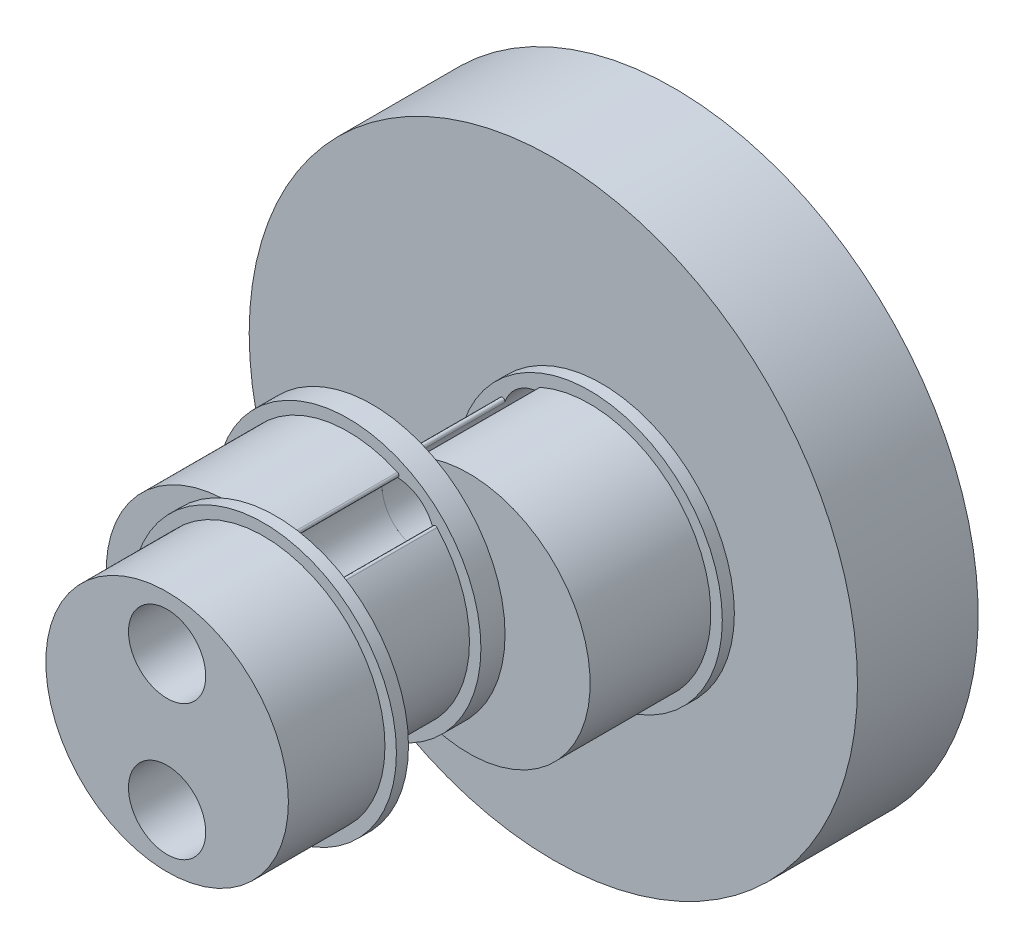
ISO-10303-21;
HEADER;
FILE_DESCRIPTION(('STEP AP214'),'2;1');
FILE_NAME('part.step','',(''),(''),'','','');
FILE_SCHEMA(('AUTOMOTIVE_DESIGN { 1 0 10303 214 1 1 1 1 }'));
ENDSEC;
DATA;
#1=APPLICATION_CONTEXT('core data for automotive mechanical design processes');
#2=APPLICATION_PROTOCOL_DEFINITION('international standard','automotive_design',2000,#1);
#3=PRODUCT_CONTEXT('',#1,'mechanical');
#4=PRODUCT('Part','Part','',(#3));
#5=PRODUCT_RELATED_PRODUCT_CATEGORY('part','',(#4));
#6=PRODUCT_DEFINITION_FORMATION('','',#4);
#7=PRODUCT_DEFINITION_CONTEXT('part definition',#1,'design');
#8=PRODUCT_DEFINITION('design','',#6,#7);
#9=PRODUCT_DEFINITION_SHAPE('','',#8);
#10=(LENGTH_UNIT() NAMED_UNIT(*) SI_UNIT(.MILLI.,.METRE.));
#11=(NAMED_UNIT(*) PLANE_ANGLE_UNIT() SI_UNIT($,.RADIAN.));
#12=(NAMED_UNIT(*) SI_UNIT($,.STERADIAN.) SOLID_ANGLE_UNIT());
#13=UNCERTAINTY_MEASURE_WITH_UNIT(LENGTH_MEASURE(1.E-05),#10,'distance_accuracy_value','');
#14=(GEOMETRIC_REPRESENTATION_CONTEXT(3) GLOBAL_UNCERTAINTY_ASSIGNED_CONTEXT((#13)) GLOBAL_UNIT_ASSIGNED_CONTEXT((#10,
#11,#12)) REPRESENTATION_CONTEXT('',''));
#15=CARTESIAN_POINT('',(0.,0.,0.));
#16=DIRECTION('',(0.,0.,1.));
#17=DIRECTION('',(1.,0.,0.));
#18=AXIS2_PLACEMENT_3D('',#15,#16,#17);
#19=CARTESIAN_POINT('',(0.,0.,8.5));
#20=DIRECTION('',(0.,0.,1.));
#21=DIRECTION('',(1.,0.,0.));
#22=AXIS2_PLACEMENT_3D('',#19,#20,#21);
#23=PLANE('',#22);
#24=CARTESIAN_POINT('',(2.,0.,8.5));
#25=DIRECTION('',(0.,0.,1.));
#26=DIRECTION('',(1.,0.,0.));
#27=AXIS2_PLACEMENT_3D('',#24,#25,#26);
#28=CIRCLE('',#27,5.025);
#29=CARTESIAN_POINT('',(-1.68090301305658,3.4207569350176,8.5));
#30=VERTEX_POINT('',#29);
#31=CARTESIAN_POINT('',(-1.68090301305658,-3.4207569350176,8.5));
#32=VERTEX_POINT('',#31);
#33=EDGE_CURVE('E126',#30,#32,#28,.T.);
#34=ORIENTED_EDGE('',*,*,#33,.T.);
#35=CARTESIAN_POINT('',(-1.60765121180172,-3.35268217014163,8.5));
#36=DIRECTION('',(0.,0.,1.));
#37=DIRECTION('',(1.,0.,0.));
#38=AXIS2_PLACEMENT_3D('',#35,#36,#37);
#39=CIRCLE('',#38,0.1);
#40=CARTESIAN_POINT('',(-1.51308349346044,-3.32017145425094,8.5));
#41=VERTEX_POINT('',#40);
#42=EDGE_CURVE('E159',#32,#41,#39,.T.);
#43=ORIENTED_EDGE('',*,*,#42,.T.);
#44=CARTESIAN_POINT('',(0.,-2.8,8.5));
#45=DIRECTION('',(0.,0.,1.));
#46=DIRECTION('',(1.,0.,0.));
#47=AXIS2_PLACEMENT_3D('',#44,#45,#46);
#48=CIRCLE('',#47,1.6);
#49=CARTESIAN_POINT('',(-0.00132429668263966,-4.39999945194937,8.5));
#50=VERTEX_POINT('',#49);
#51=EDGE_CURVE('E154',#41,#50,#48,.F.);
#52=ORIENTED_EDGE('',*,*,#51,.T.);
#53=CARTESIAN_POINT('',(-0.00140706522530469,-4.49999941769621,8.5));
#54=DIRECTION('',(0.,0.,1.));
#55=DIRECTION('',(1.,0.,0.));
#56=AXIS2_PLACEMENT_3D('',#53,#54,#55);
#57=CIRCLE('',#56,0.1);
#58=CARTESIAN_POINT('',(-0.0420447721334329,-4.59136996424842,8.5));
#59=VERTEX_POINT('',#58);
#60=EDGE_CURVE('E132',#50,#59,#57,.T.);
#61=ORIENTED_EDGE('',*,*,#60,.T.);
#62=CARTESIAN_POINT('',(-0.0420447721334338,4.59136996424842,8.5));
#63=VERTEX_POINT('',#62);
#64=EDGE_CURVE('E145',#59,#63,#28,.T.);
#65=ORIENTED_EDGE('',*,*,#64,.T.);
#66=CARTESIAN_POINT('',(-0.00140706522530566,4.49999941769621,8.5));
#67=DIRECTION('',(0.,0.,1.));
#68=DIRECTION('',(1.,0.,0.));
#69=AXIS2_PLACEMENT_3D('',#66,#67,#68);
#70=CIRCLE('',#69,0.1);
#71=CARTESIAN_POINT('',(-0.00132429668264062,4.39999945194937,8.5));
#72=VERTEX_POINT('',#71);
#73=EDGE_CURVE('E133',#63,#72,#70,.T.);
#74=ORIENTED_EDGE('',*,*,#73,.T.);
#75=CARTESIAN_POINT('',(0.,2.8,8.5));
#76=DIRECTION('',(0.,0.,1.));
#77=DIRECTION('',(1.,0.,0.));
#78=AXIS2_PLACEMENT_3D('',#75,#76,#77);
#79=CIRCLE('',#78,1.6);
#80=CARTESIAN_POINT('',(-1.51308349346044,3.32017145425094,8.5));
#81=VERTEX_POINT('',#80);
#82=EDGE_CURVE('E128',#72,#81,#79,.F.);
#83=ORIENTED_EDGE('',*,*,#82,.T.);
#84=CARTESIAN_POINT('',(-1.60765121180172,3.35268217014163,8.5));
#85=DIRECTION('',(0.,0.,1.));
#86=DIRECTION('',(1.,0.,0.));
#87=AXIS2_PLACEMENT_3D('',#84,#85,#86);
#88=CIRCLE('',#87,0.1);
#89=EDGE_CURVE('E124',#81,#30,#88,.T.);
#90=ORIENTED_EDGE('',*,*,#89,.T.);
#91=EDGE_LOOP('',(#34,#43,#52,#61,#65,#74,#83,#90));
#92=FACE_BOUND('',#91,.T.);
#93=ADVANCED_FACE('F62',(#92),#23,.T.);
#94=CARTESIAN_POINT('',(0.,0.,3.));
#95=DIRECTION('',(0.,0.,1.));
#96=DIRECTION('',(1.,0.,0.));
#97=AXIS2_PLACEMENT_3D('',#94,#95,#96);
#98=PLANE('',#97);
#99=CARTESIAN_POINT('',(2.,0.,3.));
#100=DIRECTION('',(0.,0.,1.));
#101=DIRECTION('',(1.,0.,0.));
#102=AXIS2_PLACEMENT_3D('',#99,#100,#101);
#103=CIRCLE('',#102,5.49945445757595);
#104=CARTESIAN_POINT('',(7.49945445757595,0.,3.));
#105=VERTEX_POINT('',#104);
#106=EDGE_CURVE('E196',#105,#105,#103,.T.);
#107=ORIENTED_EDGE('',*,*,#106,.F.);
#108=EDGE_LOOP('',(#107));
#109=FACE_BOUND('',#108,.T.);
#110=CARTESIAN_POINT('',(0.,0.,3.));
#111=DIRECTION('',(0.,0.,1.));
#112=DIRECTION('',(1.,0.,0.));
#113=AXIS2_PLACEMENT_3D('',#110,#111,#112);
#114=CIRCLE('',#113,12.6);
#115=CARTESIAN_POINT('',(12.6,0.,3.));
#116=VERTEX_POINT('',#115);
#117=EDGE_CURVE('E219',#116,#116,#114,.F.);
#118=ORIENTED_EDGE('',*,*,#117,.F.);
#119=EDGE_LOOP('',(#118));
#120=FACE_BOUND('',#119,.T.);
#121=ADVANCED_FACE('F236',(#109,#120),#98,.T.);
#122=CARTESIAN_POINT('',(2.,0.,3.5));
#123=DIRECTION('',(0.,0.,-1.));
#124=DIRECTION('',(-1.,0.,0.));
#125=AXIS2_PLACEMENT_3D('',#122,#123,#124);
#126=CYLINDRICAL_SURFACE('',#125,5.49945445757595);
#127=CARTESIAN_POINT('',(2.,0.,3.5));
#128=DIRECTION('',(0.,0.,1.));
#129=DIRECTION('',(1.,0.,0.));
#130=AXIS2_PLACEMENT_3D('',#127,#128,#129);
#131=CIRCLE('',#130,5.49945445757595);
#132=CARTESIAN_POINT('',(7.49945445757595,0.,3.5));
#133=VERTEX_POINT('',#132);
#134=EDGE_CURVE('E200',#133,#133,#131,.T.);
#135=ORIENTED_EDGE('',*,*,#134,.F.);
#136=EDGE_LOOP('',(#135));
#137=FACE_BOUND('',#136,.T.);
#138=ORIENTED_EDGE('',*,*,#106,.T.);
#139=EDGE_LOOP('',(#138));
#140=FACE_BOUND('',#139,.T.);
#141=ADVANCED_FACE('F232',(#137,#140),#126,.T.);
#142=CARTESIAN_POINT('',(0.,0.,38.638181771802));
#143=DIRECTION('',(0.,0.,-1.));
#144=DIRECTION('',(-1.,0.,0.));
#145=AXIS2_PLACEMENT_3D('',#142,#143,#144);
#146=CYLINDRICAL_SURFACE('',#145,12.6);
#147=CARTESIAN_POINT('',(0.,0.,-2.));
#148=DIRECTION('',(0.,0.,-1.));
#149=DIRECTION('',(-1.,0.,0.));
#150=AXIS2_PLACEMENT_3D('',#147,#148,#149);
#151=CIRCLE('',#150,12.6);
#152=CARTESIAN_POINT('',(-12.6,0.,-2.));
#153=VERTEX_POINT('',#152);
#154=EDGE_CURVE('E221',#153,#153,#151,.T.);
#155=ORIENTED_EDGE('',*,*,#154,.F.);
#156=EDGE_LOOP('',(#155));
#157=FACE_BOUND('',#156,.T.);
#158=ORIENTED_EDGE('',*,*,#117,.T.);
#159=EDGE_LOOP('',(#158));
#160=FACE_BOUND('',#159,.T.);
#161=ADVANCED_FACE('F235',(#157,#160),#146,.T.);
#162=CARTESIAN_POINT('',(2.,0.,8.5));
#163=DIRECTION('',(0.,0.,-1.));
#164=DIRECTION('',(-1.,0.,0.));
#165=AXIS2_PLACEMENT_3D('',#162,#163,#164);
#166=CYLINDRICAL_SURFACE('',#165,5.025);
#167=CARTESIAN_POINT('',(2.,0.,3.5));
#168=DIRECTION('',(0.,0.,1.));
#169=DIRECTION('',(1.,0.,0.));
#170=AXIS2_PLACEMENT_3D('',#167,#168,#169);
#171=CIRCLE('',#170,5.025);
#172=CARTESIAN_POINT('',(-1.68090301305658,3.4207569350176,3.5));
#173=VERTEX_POINT('',#172);
#174=CARTESIAN_POINT('',(-1.68090301305658,-3.4207569350176,3.5));
#175=VERTEX_POINT('',#174);
#176=EDGE_CURVE('E182',#173,#175,#171,.T.);
#177=ORIENTED_EDGE('',*,*,#176,.T.);
#178=DIRECTION('',(0.,0.,-1.));
#179=VECTOR('',#178,1.);
#180=CARTESIAN_POINT('',(-1.68090301305658,-3.4207569350176,8.5));
#181=LINE('',#180,#179);
#182=EDGE_CURVE('E143',#175,#32,#181,.F.);
#183=ORIENTED_EDGE('',*,*,#182,.T.);
#184=ORIENTED_EDGE('',*,*,#33,.F.);
#185=DIRECTION('',(0.,0.,-1.));
#186=VECTOR('',#185,1.);
#187=CARTESIAN_POINT('',(-1.68090301305658,3.4207569350176,8.5));
#188=LINE('',#187,#186);
#189=EDGE_CURVE('E140',#30,#173,#188,.T.);
#190=ORIENTED_EDGE('',*,*,#189,.T.);
#191=EDGE_LOOP('',(#177,#183,#184,#190));
#192=FACE_BOUND('',#191,.T.);
#193=ADVANCED_FACE('F139',(#192),#166,.T.);
#194=CARTESIAN_POINT('',(0.,0.,3.5));
#195=DIRECTION('',(0.,0.,1.));
#196=DIRECTION('',(1.,0.,0.));
#197=AXIS2_PLACEMENT_3D('',#194,#195,#196);
#198=PLANE('',#197);
#199=CARTESIAN_POINT('',(0.,2.8,3.5));
#200=DIRECTION('',(0.,0.,1.));
#201=DIRECTION('',(1.,0.,0.));
#202=AXIS2_PLACEMENT_3D('',#199,#200,#201);
#203=CIRCLE('',#202,1.6);
#204=CARTESIAN_POINT('',(-0.00132429668264062,4.39999945194937,3.5));
#205=VERTEX_POINT('',#204);
#206=CARTESIAN_POINT('',(-1.51308349346044,3.32017145425094,3.5));
#207=VERTEX_POINT('',#206);
#208=EDGE_CURVE('E77',#205,#207,#203,.T.);
#209=ORIENTED_EDGE('',*,*,#208,.F.);
#210=CARTESIAN_POINT('',(-0.00140706522530566,4.49999941769621,3.5));
#211=DIRECTION('',(0.,0.,1.));
#212=DIRECTION('',(1.,0.,0.));
#213=AXIS2_PLACEMENT_3D('',#210,#211,#212);
#214=CIRCLE('',#213,0.1);
#215=CARTESIAN_POINT('',(-0.0420447721334338,4.59136996424842,3.5));
#216=VERTEX_POINT('',#215);
#217=EDGE_CURVE('E14',#205,#216,#214,.F.);
#218=ORIENTED_EDGE('',*,*,#217,.T.);
#219=CARTESIAN_POINT('',(-0.0420447721334329,-4.59136996424842,3.5));
#220=VERTEX_POINT('',#219);
#221=EDGE_CURVE('E190',#220,#216,#171,.T.);
#222=ORIENTED_EDGE('',*,*,#221,.F.);
#223=CARTESIAN_POINT('',(-0.00140706522530469,-4.49999941769621,3.5));
#224=DIRECTION('',(0.,0.,1.));
#225=DIRECTION('',(1.,0.,0.));
#226=AXIS2_PLACEMENT_3D('',#223,#224,#225);
#227=CIRCLE('',#226,0.1);
#228=CARTESIAN_POINT('',(-0.00132429668263966,-4.39999945194937,3.5));
#229=VERTEX_POINT('',#228);
#230=EDGE_CURVE('E178',#220,#229,#227,.F.);
#231=ORIENTED_EDGE('',*,*,#230,.T.);
#232=CARTESIAN_POINT('',(0.,-2.8,3.5));
#233=DIRECTION('',(0.,0.,1.));
#234=DIRECTION('',(1.,0.,0.));
#235=AXIS2_PLACEMENT_3D('',#232,#233,#234);
#236=CIRCLE('',#235,1.6);
#237=CARTESIAN_POINT('',(-1.51308349346044,-3.32017145425094,3.5));
#238=VERTEX_POINT('',#237);
#239=EDGE_CURVE('E204',#238,#229,#236,.T.);
#240=ORIENTED_EDGE('',*,*,#239,.F.);
#241=CARTESIAN_POINT('',(-1.60765121180172,-3.35268217014163,3.5));
#242=DIRECTION('',(0.,0.,1.));
#243=DIRECTION('',(1.,0.,0.));
#244=AXIS2_PLACEMENT_3D('',#241,#242,#243);
#245=CIRCLE('',#244,0.1);
#246=EDGE_CURVE('E176',#238,#175,#245,.F.);
#247=ORIENTED_EDGE('',*,*,#246,.T.);
#248=ORIENTED_EDGE('',*,*,#176,.F.);
#249=CARTESIAN_POINT('',(-1.60765121180172,3.35268217014163,3.5));
#250=DIRECTION('',(0.,0.,1.));
#251=DIRECTION('',(1.,0.,0.));
#252=AXIS2_PLACEMENT_3D('',#249,#250,#251);
#253=CIRCLE('',#252,0.1);
#254=EDGE_CURVE('E70',#173,#207,#253,.F.);
#255=ORIENTED_EDGE('',*,*,#254,.T.);
#256=EDGE_LOOP('',(#209,#218,#222,#231,#240,#247,#248,#255));
#257=FACE_BOUND('',#256,.T.);
#258=ORIENTED_EDGE('',*,*,#134,.T.);
#259=EDGE_LOOP('',(#258));
#260=FACE_BOUND('',#259,.T.);
#261=ADVANCED_FACE('F180',(#257,#260),#198,.T.);
#262=ORIENTED_EDGE('',*,*,#64,.F.);
#263=DIRECTION('',(0.,0.,-1.));
#264=VECTOR('',#263,1.);
#265=CARTESIAN_POINT('',(-0.0420447721334329,-4.59136996424842,8.5));
#266=LINE('',#265,#264);
#267=EDGE_CURVE('E169',#59,#220,#266,.T.);
#268=ORIENTED_EDGE('',*,*,#267,.T.);
#269=ORIENTED_EDGE('',*,*,#221,.T.);
#270=DIRECTION('',(0.,0.,-1.));
#271=VECTOR('',#270,1.);
#272=CARTESIAN_POINT('',(-0.0420447721334338,4.59136996424842,8.5));
#273=LINE('',#272,#271);
#274=EDGE_CURVE('E166',#216,#63,#273,.F.);
#275=ORIENTED_EDGE('',*,*,#274,.T.);
#276=EDGE_LOOP('',(#262,#268,#269,#275));
#277=FACE_BOUND('',#276,.T.);
#278=ADVANCED_FACE('F193',(#277),#166,.T.);
#279=CARTESIAN_POINT('',(0.,0.,-2.));
#280=DIRECTION('',(0.,0.,-1.));
#281=DIRECTION('',(-1.,0.,0.));
#282=AXIS2_PLACEMENT_3D('',#279,#280,#281);
#283=PLANE('',#282);
#284=CARTESIAN_POINT('',(0.,2.8,-2.));
#285=DIRECTION('',(0.,0.,1.));
#286=DIRECTION('',(1.,0.,0.));
#287=AXIS2_PLACEMENT_3D('',#284,#285,#286);
#288=CIRCLE('',#287,1.6);
#289=CARTESIAN_POINT('',(1.6,2.8,-2.));
#290=VERTEX_POINT('',#289);
#291=EDGE_CURVE('E151',#290,#290,#288,.T.);
#292=ORIENTED_EDGE('',*,*,#291,.T.);
#293=EDGE_LOOP('',(#292));
#294=FACE_BOUND('',#293,.T.);
#295=CARTESIAN_POINT('',(0.,-2.8,-2.));
#296=DIRECTION('',(0.,0.,1.));
#297=DIRECTION('',(1.,0.,0.));
#298=AXIS2_PLACEMENT_3D('',#295,#296,#297);
#299=CIRCLE('',#298,1.6);
#300=CARTESIAN_POINT('',(1.6,-2.8,-2.));
#301=VERTEX_POINT('',#300);
#302=EDGE_CURVE('E147',#301,#301,#299,.T.);
#303=ORIENTED_EDGE('',*,*,#302,.T.);
#304=EDGE_LOOP('',(#303));
#305=FACE_BOUND('',#304,.T.);
#306=ORIENTED_EDGE('',*,*,#154,.T.);
#307=EDGE_LOOP('',(#306));
#308=FACE_BOUND('',#307,.T.);
#309=ADVANCED_FACE('F251',(#294,#305,#308),#283,.T.);
#310=CARTESIAN_POINT('',(0.,2.8,-2.));
#311=DIRECTION('',(0.,0.,1.));
#312=DIRECTION('',(1.,0.,0.));
#313=AXIS2_PLACEMENT_3D('',#310,#311,#312);
#314=CYLINDRICAL_SURFACE('',#313,1.6);
#315=ORIENTED_EDGE('',*,*,#291,.F.);
#316=EDGE_LOOP('',(#315));
#317=FACE_BOUND('',#316,.T.);
#318=ORIENTED_EDGE('',*,*,#208,.T.);
#319=DIRECTION('',(0.,0.,1.));
#320=VECTOR('',#319,1.);
#321=CARTESIAN_POINT('',(-1.51308349346044,3.32017145425094,-2.));
#322=LINE('',#321,#320);
#323=EDGE_CURVE('E174',#207,#81,#322,.T.);
#324=ORIENTED_EDGE('',*,*,#323,.T.);
#325=ORIENTED_EDGE('',*,*,#82,.F.);
#326=DIRECTION('',(0.,0.,1.));
#327=VECTOR('',#326,1.);
#328=CARTESIAN_POINT('',(-0.00132429668264062,4.39999945194937,-2.));
#329=LINE('',#328,#327);
#330=EDGE_CURVE('E172',#72,#205,#329,.F.);
#331=ORIENTED_EDGE('',*,*,#330,.T.);
#332=EDGE_LOOP('',(#318,#324,#325,#331));
#333=FACE_BOUND('',#332,.T.);
#334=ADVANCED_FACE('F183',(#317,#333),#314,.F.);
#335=CARTESIAN_POINT('',(0.,-2.8,-2.));
#336=DIRECTION('',(0.,0.,1.));
#337=DIRECTION('',(1.,0.,0.));
#338=AXIS2_PLACEMENT_3D('',#335,#336,#337);
#339=CYLINDRICAL_SURFACE('',#338,1.6);
#340=ORIENTED_EDGE('',*,*,#302,.F.);
#341=EDGE_LOOP('',(#340));
#342=FACE_BOUND('',#341,.T.);
#343=ORIENTED_EDGE('',*,*,#51,.F.);
#344=DIRECTION('',(0.,0.,1.));
#345=VECTOR('',#344,1.);
#346=CARTESIAN_POINT('',(-1.51308349346044,-3.32017145425094,-2.));
#347=LINE('',#346,#345);
#348=EDGE_CURVE('E163',#41,#238,#347,.F.);
#349=ORIENTED_EDGE('',*,*,#348,.T.);
#350=ORIENTED_EDGE('',*,*,#239,.T.);
#351=DIRECTION('',(0.,0.,1.));
#352=VECTOR('',#351,1.);
#353=CARTESIAN_POINT('',(-0.00132429668263966,-4.39999945194937,-2.));
#354=LINE('',#353,#352);
#355=EDGE_CURVE('E161',#229,#50,#354,.T.);
#356=ORIENTED_EDGE('',*,*,#355,.T.);
#357=EDGE_LOOP('',(#343,#349,#350,#356));
#358=FACE_BOUND('',#357,.T.);
#359=ADVANCED_FACE('F216',(#342,#358),#339,.F.);
#360=CARTESIAN_POINT('',(-1.60765121180172,-3.35268217014163,-2.));
#361=DIRECTION('',(0.,0.,-1.));
#362=DIRECTION('',(-1.,0.,0.));
#363=AXIS2_PLACEMENT_3D('',#360,#361,#362);
#364=CYLINDRICAL_SURFACE('',#363,0.1);
#365=ORIENTED_EDGE('',*,*,#246,.F.);
#366=ORIENTED_EDGE('',*,*,#348,.F.);
#367=ORIENTED_EDGE('',*,*,#42,.F.);
#368=ORIENTED_EDGE('',*,*,#182,.F.);
#369=EDGE_LOOP('',(#365,#366,#367,#368));
#370=FACE_BOUND('',#369,.T.);
#371=ADVANCED_FACE('F218',(#370),#364,.T.);
#372=CARTESIAN_POINT('',(-0.00140706522530469,-4.49999941769621,-2.));
#373=DIRECTION('',(0.,0.,1.));
#374=DIRECTION('',(1.,0.,0.));
#375=AXIS2_PLACEMENT_3D('',#372,#373,#374);
#376=CYLINDRICAL_SURFACE('',#375,0.1);
#377=ORIENTED_EDGE('',*,*,#60,.F.);
#378=ORIENTED_EDGE('',*,*,#355,.F.);
#379=ORIENTED_EDGE('',*,*,#230,.F.);
#380=ORIENTED_EDGE('',*,*,#267,.F.);
#381=EDGE_LOOP('',(#377,#378,#379,#380));
#382=FACE_BOUND('',#381,.T.);
#383=ADVANCED_FACE('F210',(#382),#376,.T.);
#384=CARTESIAN_POINT('',(-1.60765121180172,3.35268217014163,-2.));
#385=DIRECTION('',(0.,0.,1.));
#386=DIRECTION('',(1.,0.,0.));
#387=AXIS2_PLACEMENT_3D('',#384,#385,#386);
#388=CYLINDRICAL_SURFACE('',#387,0.1);
#389=ORIENTED_EDGE('',*,*,#89,.F.);
#390=ORIENTED_EDGE('',*,*,#323,.F.);
#391=ORIENTED_EDGE('',*,*,#254,.F.);
#392=ORIENTED_EDGE('',*,*,#189,.F.);
#393=EDGE_LOOP('',(#389,#390,#391,#392));
#394=FACE_BOUND('',#393,.T.);
#395=ADVANCED_FACE('F146',(#394),#388,.T.);
#396=CARTESIAN_POINT('',(-0.00140706522530566,4.49999941769621,-2.));
#397=DIRECTION('',(0.,0.,-1.));
#398=DIRECTION('',(-1.,0.,0.));
#399=AXIS2_PLACEMENT_3D('',#396,#397,#398);
#400=CYLINDRICAL_SURFACE('',#399,0.1);
#401=ORIENTED_EDGE('',*,*,#217,.F.);
#402=ORIENTED_EDGE('',*,*,#330,.F.);
#403=ORIENTED_EDGE('',*,*,#73,.F.);
#404=ORIENTED_EDGE('',*,*,#274,.F.);
#405=EDGE_LOOP('',(#401,#402,#403,#404));
#406=FACE_BOUND('',#405,.T.);
#407=ADVANCED_FACE('F64',(#406),#400,.T.);
#408=CLOSED_SHELL('',(#93,#121,#141,#161,#193,#261,#278,#309,#334,#359,#371,#383,#395,#407));
#409=MANIFOLD_SOLID_BREP('B2',#408);
#410=CARTESIAN_POINT('',(0.,0.,8.5));
#411=DIRECTION('',(0.,0.,1.));
#412=DIRECTION('',(1.,0.,0.));
#413=AXIS2_PLACEMENT_3D('',#410,#411,#412);
#414=PLANE('',#413);
#415=CARTESIAN_POINT('',(0.,2.8,8.5));
#416=DIRECTION('',(0.,0.,1.));
#417=DIRECTION('',(1.,0.,0.));
#418=AXIS2_PLACEMENT_3D('',#415,#416,#417);
#419=CIRCLE('',#418,1.6);
#420=CARTESIAN_POINT('',(1.6,2.8,8.5));
#421=VERTEX_POINT('',#420);
#422=EDGE_CURVE('E456',#421,#421,#419,.T.);
#423=ORIENTED_EDGE('',*,*,#422,.T.);
#424=EDGE_LOOP('',(#423));
#425=FACE_BOUND('',#424,.T.);
#426=CARTESIAN_POINT('',(0.,-2.8,8.5));
#427=DIRECTION('',(0.,0.,1.));
#428=DIRECTION('',(1.,0.,0.));
#429=AXIS2_PLACEMENT_3D('',#426,#427,#428);
#430=CIRCLE('',#429,1.6);
#431=CARTESIAN_POINT('',(1.6,-2.8,8.5));
#432=VERTEX_POINT('',#431);
#433=EDGE_CURVE('E468',#432,#432,#430,.T.);
#434=ORIENTED_EDGE('',*,*,#433,.T.);
#435=EDGE_LOOP('',(#434));
#436=FACE_BOUND('',#435,.T.);
#437=CARTESIAN_POINT('',(-2.,0.,8.5));
#438=DIRECTION('',(0.,0.,1.));
#439=DIRECTION('',(1.,0.,0.));
#440=AXIS2_PLACEMENT_3D('',#437,#438,#439);
#441=CIRCLE('',#440,5.5);
#442=CARTESIAN_POINT('',(3.5,0.,8.5));
#443=VERTEX_POINT('',#442);
#444=EDGE_CURVE('E462',#443,#443,#441,.T.);
#445=ORIENTED_EDGE('',*,*,#444,.F.);
#446=EDGE_LOOP('',(#445));
#447=FACE_BOUND('',#446,.T.);
#448=ADVANCED_FACE('F369',(#425,#436,#447),#414,.F.);
#449=CARTESIAN_POINT('',(0.,0.,14.5));
#450=DIRECTION('',(0.,0.,-1.));
#451=DIRECTION('',(-1.,0.,0.));
#452=AXIS2_PLACEMENT_3D('',#449,#450,#451);
#453=PLANE('',#452);
#454=CARTESIAN_POINT('',(0.,-2.8,14.5));
#455=DIRECTION('',(0.,0.,-1.));
#456=DIRECTION('',(-1.,0.,0.));
#457=AXIS2_PLACEMENT_3D('',#454,#455,#456);
#458=CIRCLE('',#457,1.6);
#459=CARTESIAN_POINT('',(1.51308349346044,-3.32017145425094,14.5));
#460=VERTEX_POINT('',#459);
#461=CARTESIAN_POINT('',(0.0013242966826422,-4.39999945194937,14.5));
#462=VERTEX_POINT('',#461);
#463=EDGE_CURVE('E477',#460,#462,#458,.F.);
#464=ORIENTED_EDGE('',*,*,#463,.F.);
#465=CARTESIAN_POINT('',(1.60765121180172,-3.35268217014163,14.5));
#466=DIRECTION('',(0.,0.,-1.));
#467=DIRECTION('',(-1.,0.,0.));
#468=AXIS2_PLACEMENT_3D('',#465,#466,#467);
#469=CIRCLE('',#468,0.1);
#470=CARTESIAN_POINT('',(1.68090301305658,-3.4207569350176,14.5));
#471=VERTEX_POINT('',#470);
#472=EDGE_CURVE('E492',#460,#471,#469,.F.);
#473=ORIENTED_EDGE('',*,*,#472,.T.);
#474=CARTESIAN_POINT('',(-2.,0.,14.5));
#475=DIRECTION('',(0.,0.,1.));
#476=DIRECTION('',(1.,0.,0.));
#477=AXIS2_PLACEMENT_3D('',#474,#475,#476);
#478=CIRCLE('',#477,5.025);
#479=CARTESIAN_POINT('',(1.68090301305658,3.4207569350176,14.5));
#480=VERTEX_POINT('',#479);
#481=EDGE_CURVE('E449',#471,#480,#478,.T.);
#482=ORIENTED_EDGE('',*,*,#481,.T.);
#483=CARTESIAN_POINT('',(1.60765121180172,3.35268217014163,14.5));
#484=DIRECTION('',(0.,0.,-1.));
#485=DIRECTION('',(-1.,0.,0.));
#486=AXIS2_PLACEMENT_3D('',#483,#484,#485);
#487=CIRCLE('',#486,0.1);
#488=CARTESIAN_POINT('',(1.51308349346044,3.32017145425094,14.5));
#489=VERTEX_POINT('',#488);
#490=EDGE_CURVE('E488',#480,#489,#487,.F.);
#491=ORIENTED_EDGE('',*,*,#490,.T.);
#492=CARTESIAN_POINT('',(0.,2.8,14.5));
#493=DIRECTION('',(0.,0.,-1.));
#494=DIRECTION('',(-1.,0.,0.));
#495=AXIS2_PLACEMENT_3D('',#492,#493,#494);
#496=CIRCLE('',#495,1.6);
#497=CARTESIAN_POINT('',(0.00132429668264022,4.39999945194937,14.5));
#498=VERTEX_POINT('',#497);
#499=EDGE_CURVE('E473',#498,#489,#496,.F.);
#500=ORIENTED_EDGE('',*,*,#499,.F.);
#501=CARTESIAN_POINT('',(0.00140706522530523,4.49999941769621,14.5));
#502=DIRECTION('',(0.,0.,-1.));
#503=DIRECTION('',(-1.,0.,0.));
#504=AXIS2_PLACEMENT_3D('',#501,#502,#503);
#505=CIRCLE('',#504,0.1);
#506=CARTESIAN_POINT('',(0.0420447721334338,4.59136996424842,14.5));
#507=VERTEX_POINT('',#506);
#508=EDGE_CURVE('E486',#498,#507,#505,.F.);
#509=ORIENTED_EDGE('',*,*,#508,.T.);
#510=CARTESIAN_POINT('',(0.0420447721334351,-4.59136996424842,14.5));
#511=VERTEX_POINT('',#510);
#512=EDGE_CURVE('E476',#507,#511,#478,.T.);
#513=ORIENTED_EDGE('',*,*,#512,.T.);
#514=CARTESIAN_POINT('',(0.00140706522530729,-4.49999941769621,14.5));
#515=DIRECTION('',(0.,0.,-1.));
#516=DIRECTION('',(-1.,0.,0.));
#517=AXIS2_PLACEMENT_3D('',#514,#515,#516);
#518=CIRCLE('',#517,0.1);
#519=EDGE_CURVE('E490',#511,#462,#518,.F.);
#520=ORIENTED_EDGE('',*,*,#519,.T.);
#521=EDGE_LOOP('',(#464,#473,#482,#491,#500,#509,#513,#520));
#522=FACE_BOUND('',#521,.T.);
#523=ADVANCED_FACE('F515',(#522),#453,.F.);
#524=CARTESIAN_POINT('',(-2.,0.,9.5));
#525=DIRECTION('',(0.,0.,1.));
#526=DIRECTION('',(1.,0.,0.));
#527=AXIS2_PLACEMENT_3D('',#524,#525,#526);
#528=PLANE('',#527);
#529=CARTESIAN_POINT('',(0.,2.8,9.5));
#530=DIRECTION('',(0.,0.,1.));
#531=DIRECTION('',(1.,0.,0.));
#532=AXIS2_PLACEMENT_3D('',#529,#530,#531);
#533=CIRCLE('',#532,1.6);
#534=CARTESIAN_POINT('',(1.51308349346044,3.32017145425094,9.5));
#535=VERTEX_POINT('',#534);
#536=CARTESIAN_POINT('',(0.00132429668264022,4.39999945194937,9.5));
#537=VERTEX_POINT('',#536);
#538=EDGE_CURVE('E383',#535,#537,#533,.T.);
#539=ORIENTED_EDGE('',*,*,#538,.F.);
#540=CARTESIAN_POINT('',(1.60765121180172,3.35268217014163,9.5));
#541=DIRECTION('',(0.,0.,1.));
#542=DIRECTION('',(1.,0.,0.));
#543=AXIS2_PLACEMENT_3D('',#540,#541,#542);
#544=CIRCLE('',#543,0.1);
#545=CARTESIAN_POINT('',(1.68090301305658,3.4207569350176,9.5));
#546=VERTEX_POINT('',#545);
#547=EDGE_CURVE('E377',#535,#546,#544,.F.);
#548=ORIENTED_EDGE('',*,*,#547,.T.);
#549=CARTESIAN_POINT('',(-2.,0.,9.5));
#550=DIRECTION('',(0.,0.,1.));
#551=DIRECTION('',(1.,0.,0.));
#552=AXIS2_PLACEMENT_3D('',#549,#550,#551);
#553=CIRCLE('',#552,5.025);
#554=CARTESIAN_POINT('',(1.68090301305658,-3.4207569350176,9.5));
#555=VERTEX_POINT('',#554);
#556=EDGE_CURVE('E446',#555,#546,#553,.T.);
#557=ORIENTED_EDGE('',*,*,#556,.F.);
#558=CARTESIAN_POINT('',(1.60765121180172,-3.35268217014163,9.5));
#559=DIRECTION('',(0.,0.,1.));
#560=DIRECTION('',(1.,0.,0.));
#561=AXIS2_PLACEMENT_3D('',#558,#559,#560);
#562=CIRCLE('',#561,0.1);
#563=CARTESIAN_POINT('',(1.51308349346044,-3.32017145425094,9.5));
#564=VERTEX_POINT('',#563);
#565=EDGE_CURVE('E431',#555,#564,#562,.F.);
#566=ORIENTED_EDGE('',*,*,#565,.T.);
#567=CARTESIAN_POINT('',(0.,-2.8,9.5));
#568=DIRECTION('',(0.,0.,1.));
#569=DIRECTION('',(1.,0.,0.));
#570=AXIS2_PLACEMENT_3D('',#567,#568,#569);
#571=CIRCLE('',#570,1.6);
#572=CARTESIAN_POINT('',(0.0013242966826422,-4.39999945194937,9.5));
#573=VERTEX_POINT('',#572);
#574=EDGE_CURVE('E471',#573,#564,#571,.T.);
#575=ORIENTED_EDGE('',*,*,#574,.F.);
#576=CARTESIAN_POINT('',(0.00140706522530729,-4.49999941769621,9.5));
#577=DIRECTION('',(0.,0.,1.));
#578=DIRECTION('',(1.,0.,0.));
#579=AXIS2_PLACEMENT_3D('',#576,#577,#578);
#580=CIRCLE('',#579,0.1);
#581=CARTESIAN_POINT('',(0.0420447721334351,-4.59136996424842,9.5));
#582=VERTEX_POINT('',#581);
#583=EDGE_CURVE('E438',#573,#582,#580,.F.);
#584=ORIENTED_EDGE('',*,*,#583,.T.);
#585=CARTESIAN_POINT('',(0.0420447721334338,4.59136996424842,9.5));
#586=VERTEX_POINT('',#585);
#587=EDGE_CURVE('E457',#586,#582,#553,.T.);
#588=ORIENTED_EDGE('',*,*,#587,.F.);
#589=CARTESIAN_POINT('',(0.00140706522530523,4.49999941769621,9.5));
#590=DIRECTION('',(0.,0.,1.));
#591=DIRECTION('',(1.,0.,0.));
#592=AXIS2_PLACEMENT_3D('',#589,#590,#591);
#593=CIRCLE('',#592,0.1);
#594=EDGE_CURVE('E60',#586,#537,#593,.F.);
#595=ORIENTED_EDGE('',*,*,#594,.T.);
#596=EDGE_LOOP('',(#539,#548,#557,#566,#575,#584,#588,#595));
#597=FACE_BOUND('',#596,.T.);
#598=CARTESIAN_POINT('',(-2.,0.,9.5));
#599=DIRECTION('',(0.,0.,1.));
#600=DIRECTION('',(1.,0.,0.));
#601=AXIS2_PLACEMENT_3D('',#598,#599,#600);
#602=CIRCLE('',#601,5.5);
#603=CARTESIAN_POINT('',(3.5,0.,9.5));
#604=VERTEX_POINT('',#603);
#605=EDGE_CURVE('E464',#604,#604,#602,.T.);
#606=ORIENTED_EDGE('',*,*,#605,.T.);
#607=EDGE_LOOP('',(#606));
#608=FACE_BOUND('',#607,.T.);
#609=ADVANCED_FACE('F453',(#597,#608),#528,.T.);
#610=CARTESIAN_POINT('',(-2.,0.,14.5));
#611=DIRECTION('',(0.,0.,-1.));
#612=DIRECTION('',(-1.,0.,0.));
#613=AXIS2_PLACEMENT_3D('',#610,#611,#612);
#614=CYLINDRICAL_SURFACE('',#613,5.025);
#615=ORIENTED_EDGE('',*,*,#481,.F.);
#616=DIRECTION('',(0.,0.,-1.));
#617=VECTOR('',#616,1.);
#618=CARTESIAN_POINT('',(1.68090301305658,-3.4207569350176,14.5));
#619=LINE('',#618,#617);
#620=EDGE_CURVE('E435',#471,#555,#619,.T.);
#621=ORIENTED_EDGE('',*,*,#620,.T.);
#622=ORIENTED_EDGE('',*,*,#556,.T.);
#623=DIRECTION('',(0.,0.,-1.));
#624=VECTOR('',#623,1.);
#625=CARTESIAN_POINT('',(1.68090301305658,3.4207569350176,14.5));
#626=LINE('',#625,#624);
#627=EDGE_CURVE('E451',#546,#480,#626,.F.);
#628=ORIENTED_EDGE('',*,*,#627,.T.);
#629=EDGE_LOOP('',(#615,#621,#622,#628));
#630=FACE_BOUND('',#629,.T.);
#631=ADVANCED_FACE('F444',(#630),#614,.T.);
#632=ORIENTED_EDGE('',*,*,#587,.T.);
#633=DIRECTION('',(0.,0.,-1.));
#634=VECTOR('',#633,1.);
#635=CARTESIAN_POINT('',(0.0420447721334355,-4.59136996424842,14.5));
#636=LINE('',#635,#634);
#637=EDGE_CURVE('E497',#582,#511,#636,.F.);
#638=ORIENTED_EDGE('',*,*,#637,.T.);
#639=ORIENTED_EDGE('',*,*,#512,.F.);
#640=DIRECTION('',(0.,0.,-1.));
#641=VECTOR('',#640,1.);
#642=CARTESIAN_POINT('',(0.0420447721334338,4.59136996424842,14.5));
#643=LINE('',#642,#641);
#644=EDGE_CURVE('E494',#507,#586,#643,.T.);
#645=ORIENTED_EDGE('',*,*,#644,.T.);
#646=EDGE_LOOP('',(#632,#638,#639,#645));
#647=FACE_BOUND('',#646,.T.);
#648=ADVANCED_FACE('F509',(#647),#614,.T.);
#649=CARTESIAN_POINT('',(0.,2.8,-2.));
#650=DIRECTION('',(0.,0.,1.));
#651=DIRECTION('',(1.,0.,0.));
#652=AXIS2_PLACEMENT_3D('',#649,#650,#651);
#653=CYLINDRICAL_SURFACE('',#652,1.6);
#654=ORIENTED_EDGE('',*,*,#422,.F.);
#655=EDGE_LOOP('',(#654));
#656=FACE_BOUND('',#655,.T.);
#657=ORIENTED_EDGE('',*,*,#499,.T.);
#658=DIRECTION('',(0.,0.,1.));
#659=VECTOR('',#658,1.);
#660=CARTESIAN_POINT('',(1.51308349346044,3.32017145425094,-2.));
#661=LINE('',#660,#659);
#662=EDGE_CURVE('E439',#489,#535,#661,.F.);
#663=ORIENTED_EDGE('',*,*,#662,.T.);
#664=ORIENTED_EDGE('',*,*,#538,.T.);
#665=DIRECTION('',(0.,0.,1.));
#666=VECTOR('',#665,1.);
#667=CARTESIAN_POINT('',(0.00132429668264022,4.39999945194937,-2.));
#668=LINE('',#667,#666);
#669=EDGE_CURVE('E500',#537,#498,#668,.T.);
#670=ORIENTED_EDGE('',*,*,#669,.T.);
#671=EDGE_LOOP('',(#657,#663,#664,#670));
#672=FACE_BOUND('',#671,.T.);
#673=ADVANCED_FACE('F520',(#656,#672),#653,.F.);
#674=CARTESIAN_POINT('',(0.,-2.8,-2.));
#675=DIRECTION('',(0.,0.,1.));
#676=DIRECTION('',(1.,0.,0.));
#677=AXIS2_PLACEMENT_3D('',#674,#675,#676);
#678=CYLINDRICAL_SURFACE('',#677,1.6);
#679=ORIENTED_EDGE('',*,*,#433,.F.);
#680=EDGE_LOOP('',(#679));
#681=FACE_BOUND('',#680,.T.);
#682=ORIENTED_EDGE('',*,*,#574,.T.);
#683=DIRECTION('',(0.,0.,1.));
#684=VECTOR('',#683,1.);
#685=CARTESIAN_POINT('',(1.51308349346044,-3.32017145425094,-2.));
#686=LINE('',#685,#684);
#687=EDGE_CURVE('E436',#564,#460,#686,.T.);
#688=ORIENTED_EDGE('',*,*,#687,.T.);
#689=ORIENTED_EDGE('',*,*,#463,.T.);
#690=DIRECTION('',(0.,0.,1.));
#691=VECTOR('',#690,1.);
#692=CARTESIAN_POINT('',(0.0013242966826422,-4.39999945194937,-2.));
#693=LINE('',#692,#691);
#694=EDGE_CURVE('E450',#462,#573,#693,.F.);
#695=ORIENTED_EDGE('',*,*,#694,.T.);
#696=EDGE_LOOP('',(#682,#688,#689,#695));
#697=FACE_BOUND('',#696,.T.);
#698=ADVANCED_FACE('F517',(#681,#697),#678,.F.);
#699=CARTESIAN_POINT('',(-2.,0.,9.5));
#700=DIRECTION('',(0.,0.,-1.));
#701=DIRECTION('',(-1.,0.,0.));
#702=AXIS2_PLACEMENT_3D('',#699,#700,#701);
#703=CYLINDRICAL_SURFACE('',#702,5.5);
#704=ORIENTED_EDGE('',*,*,#605,.F.);
#705=EDGE_LOOP('',(#704));
#706=FACE_BOUND('',#705,.T.);
#707=ORIENTED_EDGE('',*,*,#444,.T.);
#708=EDGE_LOOP('',(#707));
#709=FACE_BOUND('',#708,.T.);
#710=ADVANCED_FACE('F519',(#706,#709),#703,.T.);
#711=CARTESIAN_POINT('',(1.60765121180172,-3.35268217014163,-2.));
#712=DIRECTION('',(0.,0.,1.));
#713=DIRECTION('',(1.,0.,0.));
#714=AXIS2_PLACEMENT_3D('',#711,#712,#713);
#715=CYLINDRICAL_SURFACE('',#714,0.1);
#716=ORIENTED_EDGE('',*,*,#472,.F.);
#717=ORIENTED_EDGE('',*,*,#687,.F.);
#718=ORIENTED_EDGE('',*,*,#565,.F.);
#719=ORIENTED_EDGE('',*,*,#620,.F.);
#720=EDGE_LOOP('',(#716,#717,#718,#719));
#721=FACE_BOUND('',#720,.T.);
#722=ADVANCED_FACE('F434',(#721),#715,.T.);
#723=CARTESIAN_POINT('',(0.00140706522530729,-4.49999941769621,-2.));
#724=DIRECTION('',(0.,0.,-1.));
#725=DIRECTION('',(-1.,0.,0.));
#726=AXIS2_PLACEMENT_3D('',#723,#724,#725);
#727=CYLINDRICAL_SURFACE('',#726,0.1);
#728=ORIENTED_EDGE('',*,*,#583,.F.);
#729=ORIENTED_EDGE('',*,*,#694,.F.);
#730=ORIENTED_EDGE('',*,*,#519,.F.);
#731=ORIENTED_EDGE('',*,*,#637,.F.);
#732=EDGE_LOOP('',(#728,#729,#730,#731));
#733=FACE_BOUND('',#732,.T.);
#734=ADVANCED_FACE('F512',(#733),#727,.T.);
#735=CARTESIAN_POINT('',(1.60765121180172,3.35268217014163,-2.));
#736=DIRECTION('',(0.,0.,-1.));
#737=DIRECTION('',(-1.,0.,0.));
#738=AXIS2_PLACEMENT_3D('',#735,#736,#737);
#739=CYLINDRICAL_SURFACE('',#738,0.1);
#740=ORIENTED_EDGE('',*,*,#547,.F.);
#741=ORIENTED_EDGE('',*,*,#662,.F.);
#742=ORIENTED_EDGE('',*,*,#490,.F.);
#743=ORIENTED_EDGE('',*,*,#627,.F.);
#744=EDGE_LOOP('',(#740,#741,#742,#743));
#745=FACE_BOUND('',#744,.T.);
#746=ADVANCED_FACE('F552',(#745),#739,.T.);
#747=CARTESIAN_POINT('',(0.00140706522530523,4.49999941769621,-2.));
#748=DIRECTION('',(0.,0.,1.));
#749=DIRECTION('',(1.,0.,0.));
#750=AXIS2_PLACEMENT_3D('',#747,#748,#749);
#751=CYLINDRICAL_SURFACE('',#750,0.1);
#752=ORIENTED_EDGE('',*,*,#508,.F.);
#753=ORIENTED_EDGE('',*,*,#669,.F.);
#754=ORIENTED_EDGE('',*,*,#594,.F.);
#755=ORIENTED_EDGE('',*,*,#644,.F.);
#756=EDGE_LOOP('',(#752,#753,#754,#755));
#757=FACE_BOUND('',#756,.T.);
#758=ADVANCED_FACE('F371',(#757),#751,.T.);
#759=CLOSED_SHELL('',(#448,#523,#609,#631,#648,#673,#698,#710,#722,#734,#746,#758));
#760=MANIFOLD_SOLID_BREP('B8',#759);
#761=CARTESIAN_POINT('',(0.,0.,19.));
#762=DIRECTION('',(0.,0.,-1.));
#763=DIRECTION('',(-1.,0.,0.));
#764=AXIS2_PLACEMENT_3D('',#761,#762,#763);
#765=CYLINDRICAL_SURFACE('',#764,5.025);
#766=CARTESIAN_POINT('',(0.,0.,15.));
#767=DIRECTION('',(0.,0.,1.));
#768=DIRECTION('',(1.,0.,0.));
#769=AXIS2_PLACEMENT_3D('',#766,#767,#768);
#770=CIRCLE('',#769,5.025);
#771=CARTESIAN_POINT('',(5.025,0.,15.));
#772=VERTEX_POINT('',#771);
#773=EDGE_CURVE('E668',#772,#772,#770,.T.);
#774=ORIENTED_EDGE('',*,*,#773,.T.);
#775=EDGE_LOOP('',(#774));
#776=FACE_BOUND('',#775,.T.);
#777=CARTESIAN_POINT('',(0.,0.,19.));
#778=DIRECTION('',(0.,0.,1.));
#779=DIRECTION('',(1.,0.,0.));
#780=AXIS2_PLACEMENT_3D('',#777,#778,#779);
#781=CIRCLE('',#780,5.025);
#782=CARTESIAN_POINT('',(5.025,0.,19.));
#783=VERTEX_POINT('',#782);
#784=EDGE_CURVE('E672',#783,#783,#781,.T.);
#785=ORIENTED_EDGE('',*,*,#784,.F.);
#786=EDGE_LOOP('',(#785));
#787=FACE_BOUND('',#786,.T.);
#788=ADVANCED_FACE('F657',(#776,#787),#765,.T.);
#789=CARTESIAN_POINT('',(0.,0.,19.));
#790=DIRECTION('',(0.,0.,1.));
#791=DIRECTION('',(1.,0.,0.));
#792=AXIS2_PLACEMENT_3D('',#789,#790,#791);
#793=PLANE('',#792);
#794=CARTESIAN_POINT('',(0.,2.8,19.));
#795=DIRECTION('',(0.,0.,1.));
#796=DIRECTION('',(1.,0.,0.));
#797=AXIS2_PLACEMENT_3D('',#794,#795,#796);
#798=CIRCLE('',#797,1.6);
#799=CARTESIAN_POINT('',(1.6,2.8,19.));
#800=VERTEX_POINT('',#799);
#801=EDGE_CURVE('E681',#800,#800,#798,.T.);
#802=ORIENTED_EDGE('',*,*,#801,.F.);
#803=EDGE_LOOP('',(#802));
#804=FACE_BOUND('',#803,.T.);
#805=CARTESIAN_POINT('',(0.,-2.8,19.));
#806=DIRECTION('',(0.,0.,1.));
#807=DIRECTION('',(1.,0.,0.));
#808=AXIS2_PLACEMENT_3D('',#805,#806,#807);
#809=CIRCLE('',#808,1.6);
#810=CARTESIAN_POINT('',(1.6,-2.8,19.));
#811=VERTEX_POINT('',#810);
#812=EDGE_CURVE('E682',#811,#811,#809,.T.);
#813=ORIENTED_EDGE('',*,*,#812,.F.);
#814=EDGE_LOOP('',(#813));
#815=FACE_BOUND('',#814,.T.);
#816=ORIENTED_EDGE('',*,*,#784,.T.);
#817=EDGE_LOOP('',(#816));
#818=FACE_BOUND('',#817,.T.);
#819=ADVANCED_FACE('F691',(#804,#815,#818),#793,.T.);
#820=CARTESIAN_POINT('',(0.,2.8,-2.));
#821=DIRECTION('',(0.,0.,1.));
#822=DIRECTION('',(1.,0.,0.));
#823=AXIS2_PLACEMENT_3D('',#820,#821,#822);
#824=CYLINDRICAL_SURFACE('',#823,1.6);
#825=ORIENTED_EDGE('',*,*,#801,.T.);
#826=EDGE_LOOP('',(#825));
#827=FACE_BOUND('',#826,.T.);
#828=CARTESIAN_POINT('',(0.,2.8,14.5));
#829=DIRECTION('',(0.,0.,1.));
#830=DIRECTION('',(1.,0.,0.));
#831=AXIS2_PLACEMENT_3D('',#828,#829,#830);
#832=CIRCLE('',#831,1.6);
#833=CARTESIAN_POINT('',(1.6,2.8,14.5));
#834=VERTEX_POINT('',#833);
#835=EDGE_CURVE('E675',#834,#834,#832,.T.);
#836=ORIENTED_EDGE('',*,*,#835,.F.);
#837=EDGE_LOOP('',(#836));
#838=FACE_BOUND('',#837,.T.);
#839=ADVANCED_FACE('F688',(#827,#838),#824,.F.);
#840=CARTESIAN_POINT('',(0.,-2.8,-2.));
#841=DIRECTION('',(0.,0.,1.));
#842=DIRECTION('',(1.,0.,0.));
#843=AXIS2_PLACEMENT_3D('',#840,#841,#842);
#844=CYLINDRICAL_SURFACE('',#843,1.6);
#845=ORIENTED_EDGE('',*,*,#812,.T.);
#846=EDGE_LOOP('',(#845));
#847=FACE_BOUND('',#846,.T.);
#848=CARTESIAN_POINT('',(0.,-2.8,14.5));
#849=DIRECTION('',(0.,0.,1.));
#850=DIRECTION('',(1.,0.,0.));
#851=AXIS2_PLACEMENT_3D('',#848,#849,#850);
#852=CIRCLE('',#851,1.6);
#853=CARTESIAN_POINT('',(1.6,-2.8,14.5));
#854=VERTEX_POINT('',#853);
#855=EDGE_CURVE('E678',#854,#854,#852,.T.);
#856=ORIENTED_EDGE('',*,*,#855,.F.);
#857=EDGE_LOOP('',(#856));
#858=FACE_BOUND('',#857,.T.);
#859=ADVANCED_FACE('F717',(#847,#858),#844,.F.);
#860=CARTESIAN_POINT('',(0.,0.,15.));
#861=DIRECTION('',(0.,0.,1.));
#862=DIRECTION('',(1.,0.,0.));
#863=AXIS2_PLACEMENT_3D('',#860,#861,#862);
#864=PLANE('',#863);
#865=CARTESIAN_POINT('',(0.,0.,15.));
#866=DIRECTION('',(0.,0.,1.));
#867=DIRECTION('',(1.,0.,0.));
#868=AXIS2_PLACEMENT_3D('',#865,#866,#867);
#869=CIRCLE('',#868,5.5);
#870=CARTESIAN_POINT('',(5.5,0.,15.));
#871=VERTEX_POINT('',#870);
#872=EDGE_CURVE('E368',#871,#871,#869,.T.);
#873=ORIENTED_EDGE('',*,*,#872,.T.);
#874=EDGE_LOOP('',(#873));
#875=FACE_BOUND('',#874,.T.);
#876=ORIENTED_EDGE('',*,*,#773,.F.);
#877=EDGE_LOOP('',(#876));
#878=FACE_BOUND('',#877,.T.);
#879=ADVANCED_FACE('F712',(#875,#878),#864,.T.);
#880=CARTESIAN_POINT('',(0.,0.,15.));
#881=DIRECTION('',(0.,0.,-1.));
#882=DIRECTION('',(-1.,0.,0.));
#883=AXIS2_PLACEMENT_3D('',#880,#881,#882);
#884=CYLINDRICAL_SURFACE('',#883,5.5);
#885=ORIENTED_EDGE('',*,*,#872,.F.);
#886=EDGE_LOOP('',(#885));
#887=FACE_BOUND('',#886,.T.);
#888=CARTESIAN_POINT('',(0.,0.,14.5));
#889=DIRECTION('',(0.,0.,1.));
#890=DIRECTION('',(1.,0.,0.));
#891=AXIS2_PLACEMENT_3D('',#888,#889,#890);
#892=CIRCLE('',#891,5.5);
#893=CARTESIAN_POINT('',(5.5,0.,14.5));
#894=VERTEX_POINT('',#893);
#895=EDGE_CURVE('E661',#894,#894,#892,.T.);
#896=ORIENTED_EDGE('',*,*,#895,.T.);
#897=EDGE_LOOP('',(#896));
#898=FACE_BOUND('',#897,.T.);
#899=ADVANCED_FACE('F659',(#887,#898),#884,.T.);
#900=CARTESIAN_POINT('',(0.,0.,14.5));
#901=DIRECTION('',(0.,0.,1.));
#902=DIRECTION('',(1.,0.,0.));
#903=AXIS2_PLACEMENT_3D('',#900,#901,#902);
#904=PLANE('',#903);
#905=ORIENTED_EDGE('',*,*,#895,.F.);
#906=EDGE_LOOP('',(#905));
#907=FACE_BOUND('',#906,.T.);
#908=ORIENTED_EDGE('',*,*,#855,.T.);
#909=EDGE_LOOP('',(#908));
#910=FACE_BOUND('',#909,.T.);
#911=ORIENTED_EDGE('',*,*,#835,.T.);
#912=EDGE_LOOP('',(#911));
#913=FACE_BOUND('',#912,.T.);
#914=ADVANCED_FACE('F706',(#907,#910,#913),#904,.F.);
#915=CLOSED_SHELL('',(#788,#819,#839,#859,#879,#899,#914));
#916=MANIFOLD_SOLID_BREP('B54',#915);
#917=ADVANCED_BREP_SHAPE_REPRESENTATION('',(#18,#409,#760,#916),#14);
#918=SHAPE_DEFINITION_REPRESENTATION(#9,#917);
ENDSEC;
END-ISO-10303-21;
